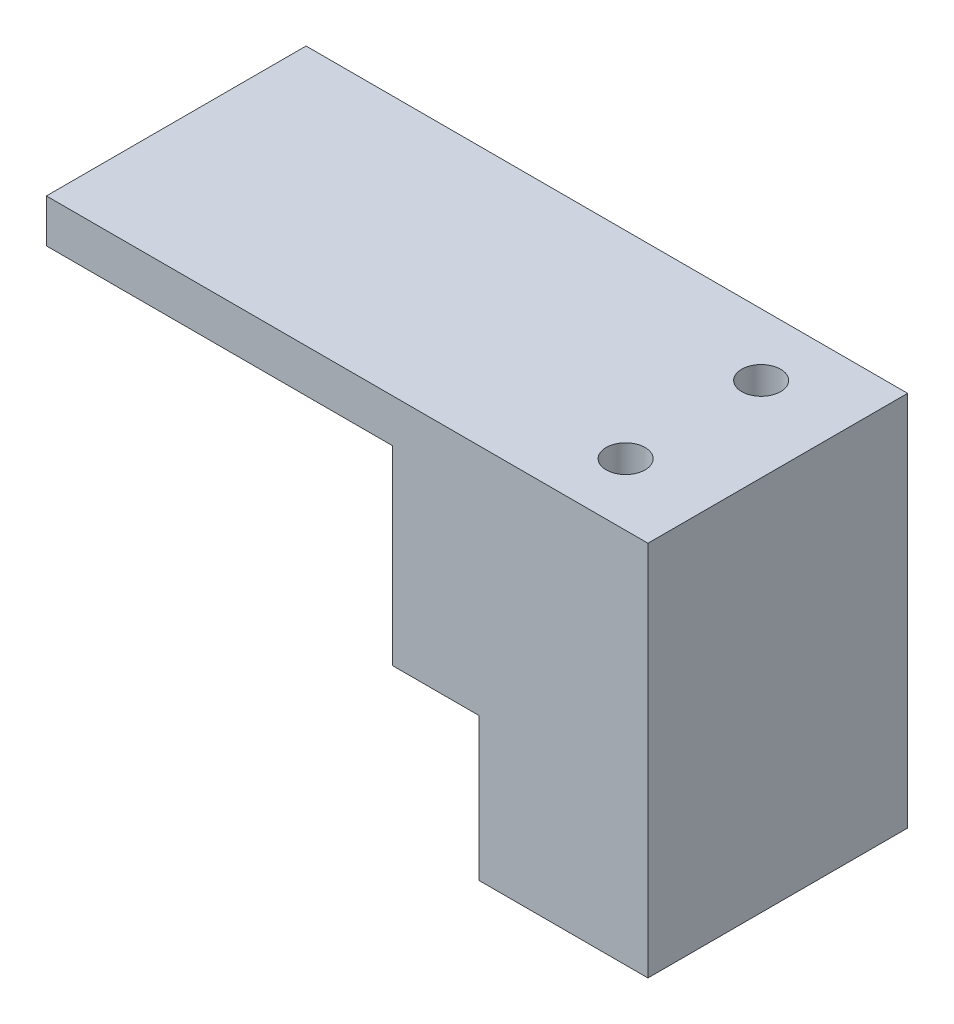
ISO-10303-21;
HEADER;
FILE_DESCRIPTION(('STEP AP214'),'2;1');
FILE_NAME('part.step','',(''),(''),'','','');
FILE_SCHEMA(('AUTOMOTIVE_DESIGN { 1 0 10303 214 1 1 1 1 }'));
ENDSEC;
DATA;
#1=APPLICATION_CONTEXT('core data for automotive mechanical design processes');
#2=APPLICATION_PROTOCOL_DEFINITION('international standard','automotive_design',2000,#1);
#3=PRODUCT_CONTEXT('',#1,'mechanical');
#4=PRODUCT('Part','Part','',(#3));
#5=PRODUCT_RELATED_PRODUCT_CATEGORY('part','',(#4));
#6=PRODUCT_DEFINITION_FORMATION('','',#4);
#7=PRODUCT_DEFINITION_CONTEXT('part definition',#1,'design');
#8=PRODUCT_DEFINITION('design','',#6,#7);
#9=PRODUCT_DEFINITION_SHAPE('','',#8);
#10=(LENGTH_UNIT() NAMED_UNIT(*) SI_UNIT(.MILLI.,.METRE.));
#11=(NAMED_UNIT(*) PLANE_ANGLE_UNIT() SI_UNIT($,.RADIAN.));
#12=(NAMED_UNIT(*) SI_UNIT($,.STERADIAN.) SOLID_ANGLE_UNIT());
#13=UNCERTAINTY_MEASURE_WITH_UNIT(LENGTH_MEASURE(1.E-05),#10,'distance_accuracy_value','');
#14=(GEOMETRIC_REPRESENTATION_CONTEXT(3) GLOBAL_UNCERTAINTY_ASSIGNED_CONTEXT((#13)) GLOBAL_UNIT_ASSIGNED_CONTEXT((#10,
#11,#12)) REPRESENTATION_CONTEXT('',''));
#15=CARTESIAN_POINT('',(0.,0.,0.));
#16=DIRECTION('',(0.,0.,1.));
#17=DIRECTION('',(1.,0.,0.));
#18=AXIS2_PLACEMENT_3D('',#15,#16,#17);
#19=CARTESIAN_POINT('',(0.,0.,0.));
#20=DIRECTION('',(0.,-1.,0.));
#21=DIRECTION('',(0.,0.,-1.));
#22=AXIS2_PLACEMENT_3D('',#19,#20,#21);
#23=PLANE('',#22);
#24=CARTESIAN_POINT('',(9.75,0.,-22.8300926632119));
#25=DIRECTION('',(0.,1.,0.));
#26=DIRECTION('',(0.,0.,1.));
#27=AXIS2_PLACEMENT_3D('',#24,#25,#26);
#28=CIRCLE('',#27,2.25);
#29=CARTESIAN_POINT('',(9.75,0.,-20.5800926632119));
#30=VERTEX_POINT('',#29);
#31=EDGE_CURVE('E128',#30,#30,#28,.T.);
#32=ORIENTED_EDGE('',*,*,#31,.T.);
#33=EDGE_LOOP('',(#32));
#34=FACE_BOUND('',#33,.T.);
#35=DIRECTION('',(0.,0.,1.));
#36=VECTOR('',#35,1.);
#37=CARTESIAN_POINT('',(0.,0.,0.));
#38=LINE('',#37,#36);
#39=CARTESIAN_POINT('',(0.,0.,-30.));
#40=VERTEX_POINT('',#39);
#41=CARTESIAN_POINT('',(0.,0.,0.));
#42=VERTEX_POINT('',#41);
#43=EDGE_CURVE('E88',#40,#42,#38,.T.);
#44=ORIENTED_EDGE('',*,*,#43,.F.);
#45=DIRECTION('',(-1.,0.,0.));
#46=VECTOR('',#45,1.);
#47=CARTESIAN_POINT('',(0.,0.,-30.));
#48=LINE('',#47,#46);
#49=CARTESIAN_POINT('',(19.5,0.,-30.));
#50=VERTEX_POINT('',#49);
#51=EDGE_CURVE('E76',#50,#40,#48,.T.);
#52=ORIENTED_EDGE('',*,*,#51,.F.);
#53=DIRECTION('',(0.,0.,-1.));
#54=VECTOR('',#53,1.);
#55=CARTESIAN_POINT('',(19.5,0.,0.));
#56=LINE('',#55,#54);
#57=CARTESIAN_POINT('',(19.5,0.,0.));
#58=VERTEX_POINT('',#57);
#59=EDGE_CURVE('E66',#58,#50,#56,.T.);
#60=ORIENTED_EDGE('',*,*,#59,.F.);
#61=DIRECTION('',(1.,0.,0.));
#62=VECTOR('',#61,1.);
#63=CARTESIAN_POINT('',(0.,0.,0.));
#64=LINE('',#63,#62);
#65=EDGE_CURVE('E77',#42,#58,#64,.T.);
#66=ORIENTED_EDGE('',*,*,#65,.F.);
#67=EDGE_LOOP('',(#44,#52,#60,#66));
#68=FACE_BOUND('',#67,.T.);
#69=CARTESIAN_POINT('',(9.75,0.,-7.16990733678813));
#70=DIRECTION('',(0.,1.,0.));
#71=DIRECTION('',(0.,0.,1.));
#72=AXIS2_PLACEMENT_3D('',#69,#70,#71);
#73=CIRCLE('',#72,2.25);
#74=CARTESIAN_POINT('',(9.75,0.,-4.91990733678813));
#75=VERTEX_POINT('',#74);
#76=EDGE_CURVE('E125',#75,#75,#73,.T.);
#77=ORIENTED_EDGE('',*,*,#76,.T.);
#78=EDGE_LOOP('',(#77));
#79=FACE_BOUND('',#78,.T.);
#80=ADVANCED_FACE('F33',(#34,#68,#79),#23,.T.);
#81=CARTESIAN_POINT('',(0.,16.5,0.));
#82=DIRECTION('',(1.,0.,0.));
#83=DIRECTION('',(0.,0.,-1.));
#84=AXIS2_PLACEMENT_3D('',#81,#82,#83);
#85=PLANE('',#84);
#86=ORIENTED_EDGE('',*,*,#43,.T.);
#87=DIRECTION('',(0.,-1.,0.));
#88=VECTOR('',#87,1.);
#89=CARTESIAN_POINT('',(0.,16.5,0.));
#90=LINE('',#89,#88);
#91=CARTESIAN_POINT('',(0.,16.5,0.));
#92=VERTEX_POINT('',#91);
#93=EDGE_CURVE('E11',#92,#42,#90,.T.);
#94=ORIENTED_EDGE('',*,*,#93,.F.);
#95=DIRECTION('',(0.,0.,1.));
#96=VECTOR('',#95,1.);
#97=CARTESIAN_POINT('',(0.,16.5,0.));
#98=LINE('',#97,#96);
#99=CARTESIAN_POINT('',(0.,16.5,-30.));
#100=VERTEX_POINT('',#99);
#101=EDGE_CURVE('E89',#100,#92,#98,.T.);
#102=ORIENTED_EDGE('',*,*,#101,.F.);
#103=DIRECTION('',(0.,-1.,0.));
#104=VECTOR('',#103,1.);
#105=CARTESIAN_POINT('',(0.,16.5,-30.));
#106=LINE('',#105,#104);
#107=EDGE_CURVE('E49',#100,#40,#106,.T.);
#108=ORIENTED_EDGE('',*,*,#107,.T.);
#109=EDGE_LOOP('',(#86,#94,#102,#108));
#110=FACE_BOUND('',#109,.T.);
#111=ADVANCED_FACE('F35',(#110),#85,.F.);
#112=CARTESIAN_POINT('',(0.,16.5,0.));
#113=DIRECTION('',(0.,0.,-1.));
#114=DIRECTION('',(-1.,0.,0.));
#115=AXIS2_PLACEMENT_3D('',#112,#113,#114);
#116=PLANE('',#115);
#117=ORIENTED_EDGE('',*,*,#65,.T.);
#118=DIRECTION('',(0.,-1.,0.));
#119=VECTOR('',#118,1.);
#120=CARTESIAN_POINT('',(19.5,16.5,0.));
#121=LINE('',#120,#119);
#122=CARTESIAN_POINT('',(19.5,43.5,0.));
#123=VERTEX_POINT('',#122);
#124=EDGE_CURVE('E42',#123,#58,#121,.T.);
#125=ORIENTED_EDGE('',*,*,#124,.F.);
#126=DIRECTION('',(1.,0.,0.));
#127=VECTOR('',#126,1.);
#128=CARTESIAN_POINT('',(-50.,43.5,0.));
#129=LINE('',#128,#127);
#130=CARTESIAN_POINT('',(-50.,43.5,0.));
#131=VERTEX_POINT('',#130);
#132=EDGE_CURVE('E176',#131,#123,#129,.T.);
#133=ORIENTED_EDGE('',*,*,#132,.F.);
#134=DIRECTION('',(0.,-1.,0.));
#135=VECTOR('',#134,1.);
#136=CARTESIAN_POINT('',(-50.,43.5,0.));
#137=LINE('',#136,#135);
#138=CARTESIAN_POINT('',(-50.,38.5,0.));
#139=VERTEX_POINT('',#138);
#140=EDGE_CURVE('E114',#131,#139,#137,.T.);
#141=ORIENTED_EDGE('',*,*,#140,.T.);
#142=DIRECTION('',(1.,0.,0.));
#143=VECTOR('',#142,1.);
#144=CARTESIAN_POINT('',(-10.,38.5,0.));
#145=LINE('',#144,#143);
#146=CARTESIAN_POINT('',(-10.,38.5,0.));
#147=VERTEX_POINT('',#146);
#148=EDGE_CURVE('E185',#139,#147,#145,.T.);
#149=ORIENTED_EDGE('',*,*,#148,.T.);
#150=DIRECTION('',(0.,-1.,0.));
#151=VECTOR('',#150,1.);
#152=CARTESIAN_POINT('',(-10.,38.5,0.));
#153=LINE('',#152,#151);
#154=CARTESIAN_POINT('',(-10.,16.5,0.));
#155=VERTEX_POINT('',#154);
#156=EDGE_CURVE('E120',#147,#155,#153,.T.);
#157=ORIENTED_EDGE('',*,*,#156,.T.);
#158=DIRECTION('',(1.,0.,0.));
#159=VECTOR('',#158,1.);
#160=CARTESIAN_POINT('',(0.,16.5,0.));
#161=LINE('',#160,#159);
#162=EDGE_CURVE('E111',#155,#92,#161,.T.);
#163=ORIENTED_EDGE('',*,*,#162,.T.);
#164=ORIENTED_EDGE('',*,*,#93,.T.);
#165=EDGE_LOOP('',(#117,#125,#133,#141,#149,#157,#163,#164));
#166=FACE_BOUND('',#165,.T.);
#167=ADVANCED_FACE('F132',(#166),#116,.F.);
#168=CARTESIAN_POINT('',(19.5,16.5,0.));
#169=DIRECTION('',(-1.,0.,0.));
#170=DIRECTION('',(0.,0.,1.));
#171=AXIS2_PLACEMENT_3D('',#168,#169,#170);
#172=PLANE('',#171);
#173=ORIENTED_EDGE('',*,*,#59,.T.);
#174=DIRECTION('',(0.,-1.,0.));
#175=VECTOR('',#174,1.);
#176=CARTESIAN_POINT('',(19.5,16.5,-30.));
#177=LINE('',#176,#175);
#178=CARTESIAN_POINT('',(19.5,43.5,-30.));
#179=VERTEX_POINT('',#178);
#180=EDGE_CURVE('E71',#179,#50,#177,.T.);
#181=ORIENTED_EDGE('',*,*,#180,.F.);
#182=DIRECTION('',(0.,0.,-1.));
#183=VECTOR('',#182,1.);
#184=CARTESIAN_POINT('',(19.5,43.5,0.));
#185=LINE('',#184,#183);
#186=EDGE_CURVE('E169',#123,#179,#185,.T.);
#187=ORIENTED_EDGE('',*,*,#186,.F.);
#188=ORIENTED_EDGE('',*,*,#124,.T.);
#189=EDGE_LOOP('',(#173,#181,#187,#188));
#190=FACE_BOUND('',#189,.T.);
#191=ADVANCED_FACE('F68',(#190),#172,.F.);
#192=CARTESIAN_POINT('',(0.,16.5,-30.));
#193=DIRECTION('',(0.,0.,1.));
#194=DIRECTION('',(1.,0.,0.));
#195=AXIS2_PLACEMENT_3D('',#192,#193,#194);
#196=PLANE('',#195);
#197=ORIENTED_EDGE('',*,*,#51,.T.);
#198=ORIENTED_EDGE('',*,*,#107,.F.);
#199=DIRECTION('',(-1.,0.,0.));
#200=VECTOR('',#199,1.);
#201=CARTESIAN_POINT('',(0.,16.5,-30.));
#202=LINE('',#201,#200);
#203=CARTESIAN_POINT('',(-10.,16.5,-30.));
#204=VERTEX_POINT('',#203);
#205=EDGE_CURVE('E102',#100,#204,#202,.T.);
#206=ORIENTED_EDGE('',*,*,#205,.T.);
#207=DIRECTION('',(0.,-1.,0.));
#208=VECTOR('',#207,1.);
#209=CARTESIAN_POINT('',(-10.,38.5,-30.));
#210=LINE('',#209,#208);
#211=CARTESIAN_POINT('',(-10.,38.5,-30.));
#212=VERTEX_POINT('',#211);
#213=EDGE_CURVE('E123',#212,#204,#210,.T.);
#214=ORIENTED_EDGE('',*,*,#213,.F.);
#215=DIRECTION('',(-1.,0.,0.));
#216=VECTOR('',#215,1.);
#217=CARTESIAN_POINT('',(-10.,38.5,-30.));
#218=LINE('',#217,#216);
#219=CARTESIAN_POINT('',(-50.,38.5,-30.));
#220=VERTEX_POINT('',#219);
#221=EDGE_CURVE('E149',#212,#220,#218,.T.);
#222=ORIENTED_EDGE('',*,*,#221,.T.);
#223=DIRECTION('',(0.,-1.,0.));
#224=VECTOR('',#223,1.);
#225=CARTESIAN_POINT('',(-50.,43.5,-30.));
#226=LINE('',#225,#224);
#227=CARTESIAN_POINT('',(-50.,43.5,-30.));
#228=VERTEX_POINT('',#227);
#229=EDGE_CURVE('E109',#228,#220,#226,.T.);
#230=ORIENTED_EDGE('',*,*,#229,.F.);
#231=DIRECTION('',(-1.,0.,0.));
#232=VECTOR('',#231,1.);
#233=CARTESIAN_POINT('',(19.5,43.5,-30.));
#234=LINE('',#233,#232);
#235=EDGE_CURVE('E82',#179,#228,#234,.T.);
#236=ORIENTED_EDGE('',*,*,#235,.F.);
#237=ORIENTED_EDGE('',*,*,#180,.T.);
#238=EDGE_LOOP('',(#197,#198,#206,#214,#222,#230,#236,#237));
#239=FACE_BOUND('',#238,.T.);
#240=ADVANCED_FACE('F79',(#239),#196,.F.);
#241=CARTESIAN_POINT('',(9.75,16.5,-22.8300926632119));
#242=DIRECTION('',(0.,-1.,0.));
#243=DIRECTION('',(0.,0.,-1.));
#244=AXIS2_PLACEMENT_3D('',#241,#242,#243);
#245=CYLINDRICAL_SURFACE('',#244,2.25);
#246=ORIENTED_EDGE('',*,*,#31,.F.);
#247=EDGE_LOOP('',(#246));
#248=FACE_BOUND('',#247,.T.);
#249=CARTESIAN_POINT('',(9.75,43.5,-22.8300926632119));
#250=DIRECTION('',(0.,1.,0.));
#251=DIRECTION('',(0.,0.,1.));
#252=AXIS2_PLACEMENT_3D('',#249,#250,#251);
#253=CIRCLE('',#252,2.25);
#254=CARTESIAN_POINT('',(9.75,43.5,-20.5800926632119));
#255=VERTEX_POINT('',#254);
#256=EDGE_CURVE('E183',#255,#255,#253,.T.);
#257=ORIENTED_EDGE('',*,*,#256,.T.);
#258=EDGE_LOOP('',(#257));
#259=FACE_BOUND('',#258,.T.);
#260=ADVANCED_FACE('F215',(#248,#259),#245,.F.);
#261=CARTESIAN_POINT('',(9.75,16.5,-7.16990733678813));
#262=DIRECTION('',(0.,-1.,0.));
#263=DIRECTION('',(0.,0.,-1.));
#264=AXIS2_PLACEMENT_3D('',#261,#262,#263);
#265=CYLINDRICAL_SURFACE('',#264,2.25);
#266=ORIENTED_EDGE('',*,*,#76,.F.);
#267=EDGE_LOOP('',(#266));
#268=FACE_BOUND('',#267,.T.);
#269=CARTESIAN_POINT('',(9.75,43.5,-7.16990733678813));
#270=DIRECTION('',(0.,1.,0.));
#271=DIRECTION('',(0.,0.,1.));
#272=AXIS2_PLACEMENT_3D('',#269,#270,#271);
#273=CIRCLE('',#272,2.25);
#274=CARTESIAN_POINT('',(9.75,43.5,-4.91990733678813));
#275=VERTEX_POINT('',#274);
#276=EDGE_CURVE('E190',#275,#275,#273,.T.);
#277=ORIENTED_EDGE('',*,*,#276,.T.);
#278=EDGE_LOOP('',(#277));
#279=FACE_BOUND('',#278,.T.);
#280=ADVANCED_FACE('F194',(#268,#279),#265,.F.);
#281=CARTESIAN_POINT('',(0.,16.5,0.));
#282=DIRECTION('',(0.,1.,0.));
#283=DIRECTION('',(0.,0.,1.));
#284=AXIS2_PLACEMENT_3D('',#281,#282,#283);
#285=PLANE('',#284);
#286=ORIENTED_EDGE('',*,*,#205,.F.);
#287=ORIENTED_EDGE('',*,*,#101,.T.);
#288=ORIENTED_EDGE('',*,*,#162,.F.);
#289=DIRECTION('',(0.,0.,1.));
#290=VECTOR('',#289,1.);
#291=CARTESIAN_POINT('',(-10.,16.5,-30.));
#292=LINE('',#291,#290);
#293=EDGE_CURVE('E106',#204,#155,#292,.T.);
#294=ORIENTED_EDGE('',*,*,#293,.F.);
#295=EDGE_LOOP('',(#286,#287,#288,#294));
#296=FACE_BOUND('',#295,.T.);
#297=ADVANCED_FACE('F103',(#296),#285,.F.);
#298=CARTESIAN_POINT('',(-10.,38.5,-30.));
#299=DIRECTION('',(1.,0.,0.));
#300=DIRECTION('',(0.,0.,-1.));
#301=AXIS2_PLACEMENT_3D('',#298,#299,#300);
#302=PLANE('',#301);
#303=ORIENTED_EDGE('',*,*,#293,.T.);
#304=ORIENTED_EDGE('',*,*,#156,.F.);
#305=DIRECTION('',(0.,0.,1.));
#306=VECTOR('',#305,1.);
#307=CARTESIAN_POINT('',(-10.,38.5,-30.));
#308=LINE('',#307,#306);
#309=EDGE_CURVE('E117',#212,#147,#308,.T.);
#310=ORIENTED_EDGE('',*,*,#309,.F.);
#311=ORIENTED_EDGE('',*,*,#213,.T.);
#312=EDGE_LOOP('',(#303,#304,#310,#311));
#313=FACE_BOUND('',#312,.T.);
#314=ADVANCED_FACE('F141',(#313),#302,.F.);
#315=CARTESIAN_POINT('',(0.,38.5,0.));
#316=DIRECTION('',(0.,1.,0.));
#317=DIRECTION('',(0.,0.,1.));
#318=AXIS2_PLACEMENT_3D('',#315,#316,#317);
#319=PLANE('',#318);
#320=ORIENTED_EDGE('',*,*,#221,.F.);
#321=ORIENTED_EDGE('',*,*,#309,.T.);
#322=ORIENTED_EDGE('',*,*,#148,.F.);
#323=DIRECTION('',(0.,0.,1.));
#324=VECTOR('',#323,1.);
#325=CARTESIAN_POINT('',(-50.,38.5,-30.));
#326=LINE('',#325,#324);
#327=EDGE_CURVE('E182',#220,#139,#326,.T.);
#328=ORIENTED_EDGE('',*,*,#327,.F.);
#329=EDGE_LOOP('',(#320,#321,#322,#328));
#330=FACE_BOUND('',#329,.T.);
#331=ADVANCED_FACE('F196',(#330),#319,.F.);
#332=CARTESIAN_POINT('',(0.,43.5,0.));
#333=DIRECTION('',(0.,1.,0.));
#334=DIRECTION('',(0.,0.,1.));
#335=AXIS2_PLACEMENT_3D('',#332,#333,#334);
#336=PLANE('',#335);
#337=ORIENTED_EDGE('',*,*,#256,.F.);
#338=EDGE_LOOP('',(#337));
#339=FACE_BOUND('',#338,.T.);
#340=ORIENTED_EDGE('',*,*,#186,.T.);
#341=ORIENTED_EDGE('',*,*,#235,.T.);
#342=DIRECTION('',(0.,0.,1.));
#343=VECTOR('',#342,1.);
#344=CARTESIAN_POINT('',(-50.,43.5,-30.));
#345=LINE('',#344,#343);
#346=EDGE_CURVE('E167',#228,#131,#345,.T.);
#347=ORIENTED_EDGE('',*,*,#346,.T.);
#348=ORIENTED_EDGE('',*,*,#132,.T.);
#349=EDGE_LOOP('',(#340,#341,#347,#348));
#350=FACE_BOUND('',#349,.T.);
#351=ORIENTED_EDGE('',*,*,#276,.F.);
#352=EDGE_LOOP('',(#351));
#353=FACE_BOUND('',#352,.T.);
#354=ADVANCED_FACE('F164',(#339,#350,#353),#336,.T.);
#355=CARTESIAN_POINT('',(-50.,43.5,-30.));
#356=DIRECTION('',(1.,0.,0.));
#357=DIRECTION('',(0.,0.,-1.));
#358=AXIS2_PLACEMENT_3D('',#355,#356,#357);
#359=PLANE('',#358);
#360=ORIENTED_EDGE('',*,*,#327,.T.);
#361=ORIENTED_EDGE('',*,*,#140,.F.);
#362=ORIENTED_EDGE('',*,*,#346,.F.);
#363=ORIENTED_EDGE('',*,*,#229,.T.);
#364=EDGE_LOOP('',(#360,#361,#362,#363));
#365=FACE_BOUND('',#364,.T.);
#366=ADVANCED_FACE('F174',(#365),#359,.F.);
#367=CLOSED_SHELL('',(#80,#111,#167,#191,#240,#260,#280,#297,#314,#331,#354,#366));
#368=MANIFOLD_SOLID_BREP('B2',#367);
#369=ADVANCED_BREP_SHAPE_REPRESENTATION('',(#18,#368),#14);
#370=SHAPE_DEFINITION_REPRESENTATION(#9,#369);
ENDSEC;
END-ISO-10303-21;
